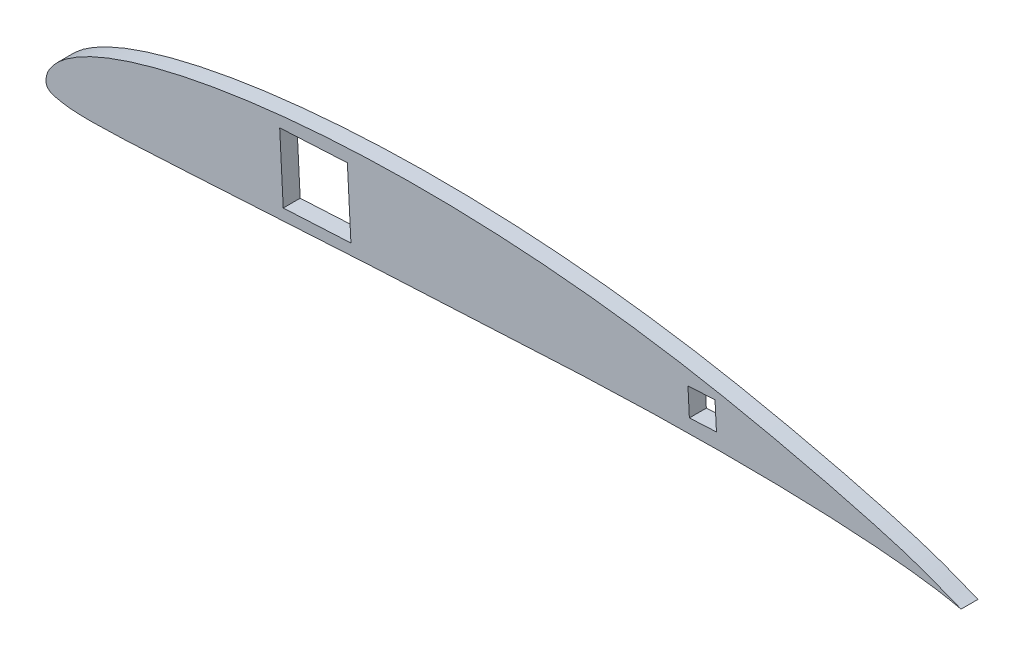
ISO-10303-21;
HEADER;
FILE_DESCRIPTION(('STEP AP214'),'2;1');
FILE_NAME('part.step','',(''),(''),'','','');
FILE_SCHEMA(('AUTOMOTIVE_DESIGN { 1 0 10303 214 1 1 1 1 }'));
ENDSEC;
DATA;
#1=APPLICATION_CONTEXT('core data for automotive mechanical design processes');
#2=APPLICATION_PROTOCOL_DEFINITION('international standard','automotive_design',2000,#1);
#3=PRODUCT_CONTEXT('',#1,'mechanical');
#4=PRODUCT('Part','Part','',(#3));
#5=PRODUCT_RELATED_PRODUCT_CATEGORY('part','',(#4));
#6=PRODUCT_DEFINITION_FORMATION('','',#4);
#7=PRODUCT_DEFINITION_CONTEXT('part definition',#1,'design');
#8=PRODUCT_DEFINITION('design','',#6,#7);
#9=PRODUCT_DEFINITION_SHAPE('','',#8);
#10=(LENGTH_UNIT() NAMED_UNIT(*) SI_UNIT(.MILLI.,.METRE.));
#11=(NAMED_UNIT(*) PLANE_ANGLE_UNIT() SI_UNIT($,.RADIAN.));
#12=(NAMED_UNIT(*) SI_UNIT($,.STERADIAN.) SOLID_ANGLE_UNIT());
#13=UNCERTAINTY_MEASURE_WITH_UNIT(LENGTH_MEASURE(1.E-05),#10,'distance_accuracy_value','');
#14=(GEOMETRIC_REPRESENTATION_CONTEXT(3) GLOBAL_UNCERTAINTY_ASSIGNED_CONTEXT((#13)) GLOBAL_UNIT_ASSIGNED_CONTEXT((#10,
#11,#12)) REPRESENTATION_CONTEXT('',''));
#15=CARTESIAN_POINT('',(0.,0.,0.));
#16=DIRECTION('',(0.,0.,1.));
#17=DIRECTION('',(1.,0.,0.));
#18=AXIS2_PLACEMENT_3D('',#15,#16,#17);
#19=CARTESIAN_POINT('',(1.48958372084306,4.18388069591457,5.));
#20=DIRECTION('',(0.,0.,-1.));
#21=DIRECTION('',(-1.,0.,0.));
#22=AXIS2_PLACEMENT_3D('',#19,#20,#21);
#23=PLANE('',#22);
#24=DIRECTION('',(-0.998629534754574,-0.0523359562429374,0.));
#25=VECTOR('',#24,1.);
#26=CARTESIAN_POINT('',(88.9258715702327,23.5193098199502,5.));
#27=LINE('',#26,#25);
#28=CARTESIAN_POINT('',(88.9258715702327,23.5193098199502,5.));
#29=VERTEX_POINT('',#28);
#30=CARTESIAN_POINT('',(68.9532808751413,22.4725906950915,5.));
#31=VERTEX_POINT('',#30);
#32=EDGE_CURVE('E138',#29,#31,#27,.T.);
#33=ORIENTED_EDGE('',*,*,#32,.F.);
#34=DIRECTION('',(-0.0523359562429375,0.998629534754574,0.));
#35=VECTOR('',#34,1.);
#36=CARTESIAN_POINT('',(89.9725906950915,3.54671912485872,5.));
#37=LINE('',#36,#35);
#38=CARTESIAN_POINT('',(89.9725906950915,3.54671912485872,5.));
#39=VERTEX_POINT('',#38);
#40=EDGE_CURVE('E146',#39,#29,#37,.T.);
#41=ORIENTED_EDGE('',*,*,#40,.F.);
#42=DIRECTION('',(0.998629534754574,0.0523359562429373,0.));
#43=VECTOR('',#42,1.);
#44=CARTESIAN_POINT('',(70.,2.49999999999998,5.));
#45=LINE('',#44,#43);
#46=CARTESIAN_POINT('',(70.,2.49999999999998,5.));
#47=VERTEX_POINT('',#46);
#48=EDGE_CURVE('E143',#47,#39,#45,.T.);
#49=ORIENTED_EDGE('',*,*,#48,.F.);
#50=DIRECTION('',(0.0523359562429368,-0.998629534754574,0.));
#51=VECTOR('',#50,1.);
#52=CARTESIAN_POINT('',(68.9532808751413,22.4725906950915,5.));
#53=LINE('',#52,#51);
#54=EDGE_CURVE('E140',#31,#47,#53,.T.);
#55=ORIENTED_EDGE('',*,*,#54,.F.);
#56=EDGE_LOOP('',(#33,#41,#49,#55));
#57=FACE_BOUND('',#56,.T.);
#58=CARTESIAN_POINT('',(270.,0.,5.));
#59=CARTESIAN_POINT('',(270.0014360667,0.00910740508498695,5.));
#60=CARTESIAN_POINT('',(268.932933557822,0.352495645864022,5.));
#61=CARTESIAN_POINT('',(267.906768705058,0.800062228703997,5.));
#62=CARTESIAN_POINT('',(265.493337403094,1.75473811170576,5.));
#63=CARTESIAN_POINT('',(262.648403106219,2.91950845694844,5.));
#64=CARTESIAN_POINT('',(259.022541080641,4.29942243260303,5.));
#65=CARTESIAN_POINT('',(254.761430831596,5.75422771444843,5.));
#66=CARTESIAN_POINT('',(249.810113571076,7.26527183587231,5.));
#67=CARTESIAN_POINT('',(244.21017544671,8.86000319046221,5.));
#68=CARTESIAN_POINT('',(237.993728290788,10.535115834764,5.));
#69=CARTESIAN_POINT('',(231.21222376915,12.2664909421061,5.));
#70=CARTESIAN_POINT('',(223.918686456541,14.035986434041,5.));
#71=CARTESIAN_POINT('',(216.168249336483,15.8176711323685,5.));
#72=CARTESIAN_POINT('',(208.019279368269,17.5868399892498,5.));
#73=CARTESIAN_POINT('',(199.531594050923,19.3088493186137,5.));
#74=CARTESIAN_POINT('',(190.757583874644,20.9526687823973,5.));
#75=CARTESIAN_POINT('',(181.729078705274,22.4465635348139,5.));
#76=CARTESIAN_POINT('',(172.485706502008,23.7788806265949,5.));
#77=CARTESIAN_POINT('',(163.067203004704,24.9496361071383,5.));
#78=CARTESIAN_POINT('',(153.514388276839,25.9260273545053,5.));
#79=CARTESIAN_POINT('',(143.873797478538,26.7206307506796,5.));
#80=CARTESIAN_POINT('',(134.190671535743,27.3179317617776,5.));
#81=CARTESIAN_POINT('',(124.515804535718,27.7064515241961,5.));
#82=CARTESIAN_POINT('',(114.898008488246,27.9026967115103,5.));
#83=CARTESIAN_POINT('',(105.384918155401,27.886864858242,5.));
#84=CARTESIAN_POINT('',(96.0258854219022,27.6680479529526,5.));
#85=CARTESIAN_POINT('',(86.8684038506323,27.2537526230879,5.));
#86=CARTESIAN_POINT('',(77.9613452334642,26.6449299280405,5.));
#87=CARTESIAN_POINT('',(69.3512981504534,25.8546018208466,5.));
#88=CARTESIAN_POINT('',(61.0839455025805,24.8871881500534,5.));
#89=CARTESIAN_POINT('',(53.2042833660714,23.7510726996345,5.));
#90=CARTESIAN_POINT('',(45.7522332397365,22.4644439817104,5.));
#91=CARTESIAN_POINT('',(38.7673170267867,21.0309444396935,5.));
#92=CARTESIAN_POINT('',(32.2854607788805,19.4682548669156,5.));
#93=CARTESIAN_POINT('',(26.3378446016865,17.7934950659202,5.));
#94=CARTESIAN_POINT('',(20.9568087425168,16.0157917509397,5.));
#95=CARTESIAN_POINT('',(16.1613307085821,14.167604477965,5.));
#96=CARTESIAN_POINT('',(11.9757307037267,12.2431034756435,5.));
#97=CARTESIAN_POINT('',(8.4190687169347,10.2590412623939,5.));
#98=CARTESIAN_POINT('',(5.47224296415656,8.27454832855855,5.));
#99=CARTESIAN_POINT('',(3.1624303225651,6.26126462358426,5.));
#100=CARTESIAN_POINT('',(1.47897938069594,4.29308317165897,5.));
#101=CARTESIAN_POINT('',(0.371136915206552,2.3887808601898,5.));
#102=CARTESIAN_POINT('',(-0.0281860539236262,0.61485563857857,5.));
#103=CARTESIAN_POINT('',(-0.0142206373523514,-1.03455531517698,5.));
#104=CARTESIAN_POINT('',(1.17017115098148,-2.32900820435546,5.));
#105=CARTESIAN_POINT('',(3.19159663794129,-2.8616102055205,5.));
#106=CARTESIAN_POINT('',(5.90093894084869,-3.41461398994113,5.));
#107=CARTESIAN_POINT('',(9.50377059385123,-3.67098844904862,5.));
#108=CARTESIAN_POINT('',(13.9401401755147,-3.73229189076624,5.));
#109=CARTESIAN_POINT('',(19.2374278625681,-3.61517977847622,5.));
#110=CARTESIAN_POINT('',(25.3684316113287,-3.36090066292526,5.));
#111=CARTESIAN_POINT('',(32.295387745952,-3.00445391740819,5.));
#112=CARTESIAN_POINT('',(39.9656881561273,-2.57018111205941,5.));
#113=CARTESIAN_POINT('',(48.322523013675,-2.07153516495246,5.));
#114=CARTESIAN_POINT('',(57.3050038651897,-1.53172129601224,5.));
#115=CARTESIAN_POINT('',(66.8467747260103,-0.961423360004259,5.));
#116=CARTESIAN_POINT('',(76.8780761891054,-0.378270294537066,5.));
#117=CARTESIAN_POINT('',(87.3250824317546,0.209915111489441,5.));
#118=CARTESIAN_POINT('',(98.1106897843523,0.793603647829826,5.));
#119=CARTESIAN_POINT('',(109.157898554784,1.36758916250899,5.));
#120=CARTESIAN_POINT('',(120.393777002651,1.94386938994531,5.));
#121=CARTESIAN_POINT('',(131.75791278309,2.54211638333123,5.));
#122=CARTESIAN_POINT('',(143.201063085681,3.13778281261522,5.));
#123=CARTESIAN_POINT('',(154.665861126763,3.70410173438214,5.));
#124=CARTESIAN_POINT('',(166.072995782862,4.17417573275371,5.));
#125=CARTESIAN_POINT('',(177.322016209765,4.51639399367127,5.));
#126=CARTESIAN_POINT('',(188.310538637782,4.74074780883225,5.));
#127=CARTESIAN_POINT('',(198.944977609885,4.83921239024152,5.));
#128=CARTESIAN_POINT('',(209.136302533756,4.80855101421534,5.));
#129=CARTESIAN_POINT('',(218.79629823797,4.64992155387397,5.));
#130=CARTESIAN_POINT('',(227.838646737916,4.36814179068766,5.));
#131=CARTESIAN_POINT('',(236.181287301788,3.9746736399858,5.));
#132=CARTESIAN_POINT('',(243.743065142294,3.48469108252562,5.));
#133=CARTESIAN_POINT('',(250.459331692246,2.91826721942611,5.));
#134=CARTESIAN_POINT('',(256.238976815333,2.31037158216879,5.));
#135=CARTESIAN_POINT('',(261.088929811527,1.66798004456643,5.));
#136=CARTESIAN_POINT('',(264.748869213918,1.08364117151456,5.));
#137=CARTESIAN_POINT('',(267.668480022305,0.489833575324206,5.));
#138=CARTESIAN_POINT('',(268.860809828443,0.278822671327756,5.));
#139=CARTESIAN_POINT('',(269.998549626617,-0.00919813677435478,5.));
#140=CARTESIAN_POINT('',(270.,0.,5.));
#141=B_SPLINE_CURVE_WITH_KNOTS('',3,(#58,#59,#60,#61,#62,#63,#64,#65,#66,#67,#68,#69,#70,#71,
#72,#73,#74,#75,#76,#77,#78,#79,#80,#81,#82,#83,#84,#85,#86,#87,#88,#89,#90,#91,#92,#93,#94,#95,
#96,#97,#98,#99,#100,#101,#102,#103,#104,#105,#106,#107,#108,#109,#110,#111,#112,#113,#114,#115,
#116,#117,#118,#119,#120,#121,#122,#123,#124,#125,#126,#127,#128,#129,#130,#131,#132,#133,#134,
#135,#136,#137,#138,#139,#140),.UNSPECIFIED.,.T.,.F.,(4,1,1,1,1,1,1,1,1,1,1,1,1,1,1,1,1,1,1,1,1,
1,1,1,1,1,1,1,1,1,1,1,1,1,1,1,1,1,1,1,1,1,1,1,1,1,1,1,1,1,1,1,1,1,1,1,1,1,1,1,1,1,1,1,1,1,1,1,1,
1,1,1,1,1,1,1,1,1,1,1,4),(0.,0.000978925200277459,0.00378591549023061,0.00817878586970771,
0.013939635702595,0.020914584154332,0.0290565975621921,0.0384135587113588,0.0489739715715676,
0.0606454194024025,0.0733338505321348,0.0869390748188673,0.101355022510081,0.116470864670874,
0.132170766848874,0.148332165360986,0.164889947509332,0.181806831021788,0.198986828660527,
0.216369092592437,0.233891214474879,0.25145520462322,0.268989943534912,0.286410198751259,
0.30363306022829,0.320588512817723,0.337187269596329,0.353353473374656,0.36901233500621,
0.384083454981517,0.398499749186594,0.412191496678254,0.425098469382076,0.437171363117538,
0.448351495068995,0.458605678988818,0.467900990608339,0.476215592972652,0.48357299062513,
0.489970137349999,0.495456443583994,0.500131702922336,0.503991848386412,0.507230007900311,
0.509986766870744,0.512500662152879,0.516073685181018,0.521095012002638,0.527571392405465,
0.535587320266656,0.545177110955053,0.556301642956373,0.568874715443027,0.582800205502827,
0.597975201944563,0.614286016356002,0.631612678153747,0.649825892256692,0.668791608390084,
0.688371085664615,0.708416852810966,0.728796853365483,0.749399048787055,0.770145767160638,
0.790953093304618,0.811664203475039,0.832074040882521,0.851999343771333,0.871281671964732,
0.889760566338039,0.907279933600535,0.923686413750604,0.938832510110946,0.952579326689716,
0.964796492179185,0.975364982161422,0.984179191960217,0.991107071249204,0.996049394239127,
0.999011322347037,1.),.UNSPECIFIED.);
#142=CARTESIAN_POINT('',(270.,0.,5.));
#143=VERTEX_POINT('',#142);
#144=EDGE_CURVE('E11',#143,#143,#141,.T.);
#145=ORIENTED_EDGE('',*,*,#144,.T.);
#146=EDGE_LOOP('',(#145));
#147=FACE_BOUND('',#146,.T.);
#148=DIRECTION('',(-0.998629534754574,-0.0523359562429382,0.));
#149=VECTOR('',#148,1.);
#150=CARTESIAN_POINT('',(197.405892798642,17.1880386771326,5.));
#151=LINE('',#150,#149);
#152=CARTESIAN_POINT('',(197.405892798642,17.1880386771326,5.));
#153=VERTEX_POINT('',#152);
#154=CARTESIAN_POINT('',(189.416856520605,16.7693510271891,5.));
#155=VERTEX_POINT('',#154);
#156=EDGE_CURVE('E102',#153,#155,#151,.T.);
#157=ORIENTED_EDGE('',*,*,#156,.F.);
#158=DIRECTION('',(-0.0523359562429396,0.998629534754574,0.));
#159=VECTOR('',#158,1.);
#160=CARTESIAN_POINT('',(197.824580448586,9.19900239909598,5.));
#161=LINE('',#160,#159);
#162=CARTESIAN_POINT('',(197.824580448586,9.19900239909598,5.));
#163=VERTEX_POINT('',#162);
#164=EDGE_CURVE('E124',#163,#153,#161,.T.);
#165=ORIENTED_EDGE('',*,*,#164,.F.);
#166=DIRECTION('',(0.998629534754574,0.0523359562429374,0.));
#167=VECTOR('',#166,1.);
#168=CARTESIAN_POINT('',(189.835544170549,8.78031474915248,5.));
#169=LINE('',#168,#167);
#170=CARTESIAN_POINT('',(189.835544170549,8.78031474915248,5.));
#171=VERTEX_POINT('',#170);
#172=EDGE_CURVE('E122',#171,#163,#169,.T.);
#173=ORIENTED_EDGE('',*,*,#172,.F.);
#174=DIRECTION('',(0.0523359562429362,-0.998629534754574,0.));
#175=VECTOR('',#174,1.);
#176=CARTESIAN_POINT('',(189.416856520605,16.7693510271891,5.));
#177=LINE('',#176,#175);
#178=EDGE_CURVE('E110',#155,#171,#177,.T.);
#179=ORIENTED_EDGE('',*,*,#178,.F.);
#180=EDGE_LOOP('',(#157,#165,#173,#179));
#181=FACE_BOUND('',#180,.T.);
#182=ADVANCED_FACE('F35',(#57,#147,#181),#23,.F.);
#183=CARTESIAN_POINT('',(1.48958372084306,4.18388069591457,0.));
#184=DIRECTION('',(0.,0.,-1.));
#185=DIRECTION('',(-1.,0.,0.));
#186=AXIS2_PLACEMENT_3D('',#183,#184,#185);
#187=PLANE('',#186);
#188=CARTESIAN_POINT('',(270.,0.,0.));
#189=CARTESIAN_POINT('',(270.0014360667,0.00910740508498695,0.));
#190=CARTESIAN_POINT('',(268.932933557822,0.352495645864022,0.));
#191=CARTESIAN_POINT('',(267.906768705058,0.800062228703997,0.));
#192=CARTESIAN_POINT('',(265.493337403094,1.75473811170576,0.));
#193=CARTESIAN_POINT('',(262.648403106219,2.91950845694844,0.));
#194=CARTESIAN_POINT('',(259.022541080641,4.29942243260303,0.));
#195=CARTESIAN_POINT('',(254.761430831596,5.75422771444843,0.));
#196=CARTESIAN_POINT('',(249.810113571076,7.26527183587231,0.));
#197=CARTESIAN_POINT('',(244.21017544671,8.86000319046221,0.));
#198=CARTESIAN_POINT('',(237.993728290788,10.535115834764,0.));
#199=CARTESIAN_POINT('',(231.21222376915,12.2664909421061,0.));
#200=CARTESIAN_POINT('',(223.918686456541,14.035986434041,0.));
#201=CARTESIAN_POINT('',(216.168249336483,15.8176711323685,0.));
#202=CARTESIAN_POINT('',(208.019279368269,17.5868399892498,0.));
#203=CARTESIAN_POINT('',(199.531594050923,19.3088493186137,0.));
#204=CARTESIAN_POINT('',(190.757583874644,20.9526687823973,0.));
#205=CARTESIAN_POINT('',(181.729078705274,22.4465635348139,0.));
#206=CARTESIAN_POINT('',(172.485706502008,23.7788806265949,0.));
#207=CARTESIAN_POINT('',(163.067203004704,24.9496361071383,0.));
#208=CARTESIAN_POINT('',(153.514388276839,25.9260273545053,0.));
#209=CARTESIAN_POINT('',(143.873797478538,26.7206307506796,0.));
#210=CARTESIAN_POINT('',(134.190671535743,27.3179317617776,0.));
#211=CARTESIAN_POINT('',(124.515804535718,27.7064515241961,0.));
#212=CARTESIAN_POINT('',(114.898008488246,27.9026967115103,0.));
#213=CARTESIAN_POINT('',(105.384918155401,27.886864858242,0.));
#214=CARTESIAN_POINT('',(96.0258854219022,27.6680479529526,0.));
#215=CARTESIAN_POINT('',(86.8684038506323,27.2537526230879,0.));
#216=CARTESIAN_POINT('',(77.9613452334642,26.6449299280405,0.));
#217=CARTESIAN_POINT('',(69.3512981504534,25.8546018208466,0.));
#218=CARTESIAN_POINT('',(61.0839455025805,24.8871881500534,0.));
#219=CARTESIAN_POINT('',(53.2042833660714,23.7510726996345,0.));
#220=CARTESIAN_POINT('',(45.7522332397365,22.4644439817104,0.));
#221=CARTESIAN_POINT('',(38.7673170267867,21.0309444396935,0.));
#222=CARTESIAN_POINT('',(32.2854607788805,19.4682548669156,0.));
#223=CARTESIAN_POINT('',(26.3378446016865,17.7934950659202,0.));
#224=CARTESIAN_POINT('',(20.9568087425168,16.0157917509397,0.));
#225=CARTESIAN_POINT('',(16.1613307085821,14.167604477965,0.));
#226=CARTESIAN_POINT('',(11.9757307037267,12.2431034756435,0.));
#227=CARTESIAN_POINT('',(8.4190687169347,10.2590412623939,0.));
#228=CARTESIAN_POINT('',(5.47224296415656,8.27454832855855,0.));
#229=CARTESIAN_POINT('',(3.1624303225651,6.26126462358426,0.));
#230=CARTESIAN_POINT('',(1.47897938069594,4.29308317165897,0.));
#231=CARTESIAN_POINT('',(0.371136915206552,2.3887808601898,0.));
#232=CARTESIAN_POINT('',(-0.0281860539236262,0.61485563857857,0.));
#233=CARTESIAN_POINT('',(-0.0142206373523514,-1.03455531517698,0.));
#234=CARTESIAN_POINT('',(1.17017115098148,-2.32900820435546,0.));
#235=CARTESIAN_POINT('',(3.19159663794129,-2.8616102055205,0.));
#236=CARTESIAN_POINT('',(5.90093894084869,-3.41461398994113,0.));
#237=CARTESIAN_POINT('',(9.50377059385123,-3.67098844904862,0.));
#238=CARTESIAN_POINT('',(13.9401401755147,-3.73229189076624,0.));
#239=CARTESIAN_POINT('',(19.2374278625681,-3.61517977847622,0.));
#240=CARTESIAN_POINT('',(25.3684316113287,-3.36090066292526,0.));
#241=CARTESIAN_POINT('',(32.295387745952,-3.00445391740819,0.));
#242=CARTESIAN_POINT('',(39.9656881561273,-2.57018111205941,0.));
#243=CARTESIAN_POINT('',(48.322523013675,-2.07153516495246,0.));
#244=CARTESIAN_POINT('',(57.3050038651897,-1.53172129601224,0.));
#245=CARTESIAN_POINT('',(66.8467747260103,-0.961423360004259,0.));
#246=CARTESIAN_POINT('',(76.8780761891054,-0.378270294537066,0.));
#247=CARTESIAN_POINT('',(87.3250824317546,0.209915111489441,0.));
#248=CARTESIAN_POINT('',(98.1106897843523,0.793603647829826,0.));
#249=CARTESIAN_POINT('',(109.157898554784,1.36758916250899,0.));
#250=CARTESIAN_POINT('',(120.393777002651,1.94386938994531,0.));
#251=CARTESIAN_POINT('',(131.75791278309,2.54211638333123,0.));
#252=CARTESIAN_POINT('',(143.201063085681,3.13778281261522,0.));
#253=CARTESIAN_POINT('',(154.665861126763,3.70410173438214,0.));
#254=CARTESIAN_POINT('',(166.072995782862,4.17417573275371,0.));
#255=CARTESIAN_POINT('',(177.322016209765,4.51639399367127,0.));
#256=CARTESIAN_POINT('',(188.310538637782,4.74074780883225,0.));
#257=CARTESIAN_POINT('',(198.944977609885,4.83921239024152,0.));
#258=CARTESIAN_POINT('',(209.136302533756,4.80855101421534,0.));
#259=CARTESIAN_POINT('',(218.79629823797,4.64992155387397,0.));
#260=CARTESIAN_POINT('',(227.838646737916,4.36814179068766,0.));
#261=CARTESIAN_POINT('',(236.181287301788,3.9746736399858,0.));
#262=CARTESIAN_POINT('',(243.743065142294,3.48469108252562,0.));
#263=CARTESIAN_POINT('',(250.459331692246,2.91826721942611,0.));
#264=CARTESIAN_POINT('',(256.238976815333,2.31037158216879,0.));
#265=CARTESIAN_POINT('',(261.088929811527,1.66798004456643,0.));
#266=CARTESIAN_POINT('',(264.748869213918,1.08364117151456,0.));
#267=CARTESIAN_POINT('',(267.668480022305,0.489833575324206,0.));
#268=CARTESIAN_POINT('',(268.860809828443,0.278822671327756,0.));
#269=CARTESIAN_POINT('',(269.998549626617,-0.00919813677435478,0.));
#270=CARTESIAN_POINT('',(270.,0.,0.));
#271=B_SPLINE_CURVE_WITH_KNOTS('',3,(#188,#189,#190,#191,#192,#193,#194,#195,#196,#197,#198,
#199,#200,#201,#202,#203,#204,#205,#206,#207,#208,#209,#210,#211,#212,#213,#214,#215,#216,#217,
#218,#219,#220,#221,#222,#223,#224,#225,#226,#227,#228,#229,#230,#231,#232,#233,#234,#235,#236,
#237,#238,#239,#240,#241,#242,#243,#244,#245,#246,#247,#248,#249,#250,#251,#252,#253,#254,#255,
#256,#257,#258,#259,#260,#261,#262,#263,#264,#265,#266,#267,#268,#269,#270),.UNSPECIFIED.,.T.,
.F.,(4,1,1,1,1,1,1,1,1,1,1,1,1,1,1,1,1,1,1,1,1,1,1,1,1,1,1,1,1,1,1,1,1,1,1,1,1,1,1,1,1,1,1,1,1,
1,1,1,1,1,1,1,1,1,1,1,1,1,1,1,1,1,1,1,1,1,1,1,1,1,1,1,1,1,1,1,1,1,1,1,4),(0.,
0.000978925200277459,0.00378591549023061,0.00817878586970771,0.013939635702595,
0.020914584154332,0.0290565975621921,0.0384135587113588,0.0489739715715676,0.0606454194024025,
0.0733338505321348,0.0869390748188673,0.101355022510081,0.116470864670874,0.132170766848874,
0.148332165360986,0.164889947509332,0.181806831021788,0.198986828660527,0.216369092592437,
0.233891214474879,0.25145520462322,0.268989943534912,0.286410198751259,0.30363306022829,
0.320588512817723,0.337187269596329,0.353353473374656,0.36901233500621,0.384083454981517,
0.398499749186594,0.412191496678254,0.425098469382076,0.437171363117538,0.448351495068995,
0.458605678988818,0.467900990608339,0.476215592972652,0.48357299062513,0.489970137349999,
0.495456443583994,0.500131702922336,0.503991848386412,0.507230007900311,0.509986766870744,
0.512500662152879,0.516073685181018,0.521095012002638,0.527571392405465,0.535587320266656,
0.545177110955053,0.556301642956373,0.568874715443027,0.582800205502827,0.597975201944563,
0.614286016356002,0.631612678153747,0.649825892256692,0.668791608390084,0.688371085664615,
0.708416852810966,0.728796853365483,0.749399048787055,0.770145767160638,0.790953093304618,
0.811664203475039,0.832074040882521,0.851999343771333,0.871281671964732,0.889760566338039,
0.907279933600535,0.923686413750604,0.938832510110946,0.952579326689716,0.964796492179185,
0.975364982161422,0.984179191960217,0.991107071249204,0.996049394239127,0.999011322347037,1.),.UNSPECIFIED.);
#272=CARTESIAN_POINT('',(270.,0.,0.));
#273=VERTEX_POINT('',#272);
#274=EDGE_CURVE('E40',#273,#273,#271,.T.);
#275=ORIENTED_EDGE('',*,*,#274,.F.);
#276=EDGE_LOOP('',(#275));
#277=FACE_BOUND('',#276,.T.);
#278=DIRECTION('',(-0.0523359562429375,0.998629534754574,0.));
#279=VECTOR('',#278,1.);
#280=CARTESIAN_POINT('',(89.9725906950915,3.54671912485872,0.));
#281=LINE('',#280,#279);
#282=CARTESIAN_POINT('',(89.9725906950915,3.54671912485872,0.));
#283=VERTEX_POINT('',#282);
#284=CARTESIAN_POINT('',(88.9258715702328,23.5193098199502,0.));
#285=VERTEX_POINT('',#284);
#286=EDGE_CURVE('E141',#283,#285,#281,.T.);
#287=ORIENTED_EDGE('',*,*,#286,.T.);
#288=DIRECTION('',(-0.998629534754574,-0.0523359562429374,0.));
#289=VECTOR('',#288,1.);
#290=CARTESIAN_POINT('',(88.9258715702327,23.5193098199502,0.));
#291=LINE('',#290,#289);
#292=CARTESIAN_POINT('',(68.9532808751413,22.4725906950915,0.));
#293=VERTEX_POINT('',#292);
#294=EDGE_CURVE('E118',#285,#293,#291,.T.);
#295=ORIENTED_EDGE('',*,*,#294,.T.);
#296=DIRECTION('',(0.0523359562429368,-0.998629534754574,0.));
#297=VECTOR('',#296,1.);
#298=CARTESIAN_POINT('',(68.9532808751413,22.4725906950915,0.));
#299=LINE('',#298,#297);
#300=CARTESIAN_POINT('',(70.,2.49999999999998,0.));
#301=VERTEX_POINT('',#300);
#302=EDGE_CURVE('E151',#293,#301,#299,.T.);
#303=ORIENTED_EDGE('',*,*,#302,.T.);
#304=DIRECTION('',(0.998629534754574,0.0523359562429373,0.));
#305=VECTOR('',#304,1.);
#306=CARTESIAN_POINT('',(70.,2.49999999999998,0.));
#307=LINE('',#306,#305);
#308=EDGE_CURVE('E154',#301,#283,#307,.T.);
#309=ORIENTED_EDGE('',*,*,#308,.T.);
#310=EDGE_LOOP('',(#287,#295,#303,#309));
#311=FACE_BOUND('',#310,.T.);
#312=DIRECTION('',(-0.0523359562429396,0.998629534754574,0.));
#313=VECTOR('',#312,1.);
#314=CARTESIAN_POINT('',(197.824580448586,9.19900239909598,0.));
#315=LINE('',#314,#313);
#316=CARTESIAN_POINT('',(197.824580448586,9.19900239909598,0.));
#317=VERTEX_POINT('',#316);
#318=CARTESIAN_POINT('',(197.405892798642,17.1880386771326,0.));
#319=VERTEX_POINT('',#318);
#320=EDGE_CURVE('E111',#317,#319,#315,.T.);
#321=ORIENTED_EDGE('',*,*,#320,.T.);
#322=DIRECTION('',(-0.998629534754574,-0.0523359562429382,0.));
#323=VECTOR('',#322,1.);
#324=CARTESIAN_POINT('',(197.405892798642,17.1880386771326,0.));
#325=LINE('',#324,#323);
#326=CARTESIAN_POINT('',(189.416856520605,16.7693510271891,0.));
#327=VERTEX_POINT('',#326);
#328=EDGE_CURVE('E60',#319,#327,#325,.T.);
#329=ORIENTED_EDGE('',*,*,#328,.T.);
#330=DIRECTION('',(0.0523359562429362,-0.998629534754574,0.));
#331=VECTOR('',#330,1.);
#332=CARTESIAN_POINT('',(189.416856520605,16.7693510271891,0.));
#333=LINE('',#332,#331);
#334=CARTESIAN_POINT('',(189.835544170549,8.78031474915248,0.));
#335=VERTEX_POINT('',#334);
#336=EDGE_CURVE('E117',#327,#335,#333,.T.);
#337=ORIENTED_EDGE('',*,*,#336,.T.);
#338=DIRECTION('',(0.998629534754574,0.0523359562429374,0.));
#339=VECTOR('',#338,1.);
#340=CARTESIAN_POINT('',(189.835544170549,8.78031474915248,0.));
#341=LINE('',#340,#339);
#342=EDGE_CURVE('E130',#335,#317,#341,.T.);
#343=ORIENTED_EDGE('',*,*,#342,.T.);
#344=EDGE_LOOP('',(#321,#329,#337,#343));
#345=FACE_BOUND('',#344,.T.);
#346=ADVANCED_FACE('F179',(#277,#311,#345),#187,.T.);
#347=DIRECTION('',(0.,0.,-1.));
#348=VECTOR('',#347,1.);
#349=SURFACE_OF_LINEAR_EXTRUSION('',#141,#348);
#350=ORIENTED_EDGE('',*,*,#144,.F.);
#351=EDGE_LOOP('',(#350));
#352=FACE_BOUND('',#351,.T.);
#353=ORIENTED_EDGE('',*,*,#274,.T.);
#354=EDGE_LOOP('',(#353));
#355=FACE_BOUND('',#354,.T.);
#356=ADVANCED_FACE('F37',(#352,#355),#349,.F.);
#357=CARTESIAN_POINT('',(88.9258715702327,23.5193098199502,5.));
#358=DIRECTION('',(0.0523359562429374,-0.998629534754574,0.));
#359=DIRECTION('',(0.998629534754574,0.0523359562429374,0.));
#360=AXIS2_PLACEMENT_3D('',#357,#358,#359);
#361=PLANE('',#360);
#362=ORIENTED_EDGE('',*,*,#294,.F.);
#363=DIRECTION('',(0.,0.,-1.));
#364=VECTOR('',#363,1.);
#365=CARTESIAN_POINT('',(88.9258715702327,23.5193098199502,5.));
#366=LINE('',#365,#364);
#367=EDGE_CURVE('E148',#29,#285,#366,.T.);
#368=ORIENTED_EDGE('',*,*,#367,.F.);
#369=ORIENTED_EDGE('',*,*,#32,.T.);
#370=DIRECTION('',(0.,0.,-1.));
#371=VECTOR('',#370,1.);
#372=CARTESIAN_POINT('',(68.9532808751413,22.4725906950915,5.));
#373=LINE('',#372,#371);
#374=EDGE_CURVE('E165',#31,#293,#373,.T.);
#375=ORIENTED_EDGE('',*,*,#374,.T.);
#376=EDGE_LOOP('',(#362,#368,#369,#375));
#377=FACE_BOUND('',#376,.T.);
#378=ADVANCED_FACE('F202',(#377),#361,.T.);
#379=CARTESIAN_POINT('',(68.9532808751413,22.4725906950915,5.));
#380=DIRECTION('',(0.998629534754574,0.0523359562429368,0.));
#381=DIRECTION('',(-0.0523359562429368,0.998629534754574,0.));
#382=AXIS2_PLACEMENT_3D('',#379,#380,#381);
#383=PLANE('',#382);
#384=ORIENTED_EDGE('',*,*,#302,.F.);
#385=ORIENTED_EDGE('',*,*,#374,.F.);
#386=ORIENTED_EDGE('',*,*,#54,.T.);
#387=DIRECTION('',(0.,0.,-1.));
#388=VECTOR('',#387,1.);
#389=CARTESIAN_POINT('',(70.,2.49999999999998,5.));
#390=LINE('',#389,#388);
#391=EDGE_CURVE('E163',#47,#301,#390,.T.);
#392=ORIENTED_EDGE('',*,*,#391,.T.);
#393=EDGE_LOOP('',(#384,#385,#386,#392));
#394=FACE_BOUND('',#393,.T.);
#395=ADVANCED_FACE('F205',(#394),#383,.T.);
#396=CARTESIAN_POINT('',(70.,2.49999999999998,5.));
#397=DIRECTION('',(-0.0523359562429373,0.998629534754574,0.));
#398=DIRECTION('',(-0.998629534754574,-0.0523359562429373,0.));
#399=AXIS2_PLACEMENT_3D('',#396,#397,#398);
#400=PLANE('',#399);
#401=ORIENTED_EDGE('',*,*,#308,.F.);
#402=ORIENTED_EDGE('',*,*,#391,.F.);
#403=ORIENTED_EDGE('',*,*,#48,.T.);
#404=DIRECTION('',(0.,0.,-1.));
#405=VECTOR('',#404,1.);
#406=CARTESIAN_POINT('',(89.9725906950915,3.54671912485872,5.));
#407=LINE('',#406,#405);
#408=EDGE_CURVE('E161',#39,#283,#407,.T.);
#409=ORIENTED_EDGE('',*,*,#408,.T.);
#410=EDGE_LOOP('',(#401,#402,#403,#409));
#411=FACE_BOUND('',#410,.T.);
#412=ADVANCED_FACE('F208',(#411),#400,.T.);
#413=CARTESIAN_POINT('',(89.9725906950915,3.54671912485872,5.));
#414=DIRECTION('',(-0.998629534754574,-0.0523359562429375,0.));
#415=DIRECTION('',(0.0523359562429375,-0.998629534754574,0.));
#416=AXIS2_PLACEMENT_3D('',#413,#414,#415);
#417=PLANE('',#416);
#418=ORIENTED_EDGE('',*,*,#286,.F.);
#419=ORIENTED_EDGE('',*,*,#408,.F.);
#420=ORIENTED_EDGE('',*,*,#40,.T.);
#421=ORIENTED_EDGE('',*,*,#367,.T.);
#422=EDGE_LOOP('',(#418,#419,#420,#421));
#423=FACE_BOUND('',#422,.T.);
#424=ADVANCED_FACE('F212',(#423),#417,.T.);
#425=CARTESIAN_POINT('',(197.405892798642,17.1880386771326,5.));
#426=DIRECTION('',(0.0523359562429382,-0.998629534754574,0.));
#427=DIRECTION('',(0.998629534754574,0.0523359562429382,0.));
#428=AXIS2_PLACEMENT_3D('',#425,#426,#427);
#429=PLANE('',#428);
#430=ORIENTED_EDGE('',*,*,#328,.F.);
#431=DIRECTION('',(0.,0.,-1.));
#432=VECTOR('',#431,1.);
#433=CARTESIAN_POINT('',(197.405892798642,17.1880386771326,5.));
#434=LINE('',#433,#432);
#435=EDGE_CURVE('E106',#153,#319,#434,.T.);
#436=ORIENTED_EDGE('',*,*,#435,.F.);
#437=ORIENTED_EDGE('',*,*,#156,.T.);
#438=DIRECTION('',(0.,0.,-1.));
#439=VECTOR('',#438,1.);
#440=CARTESIAN_POINT('',(189.416856520605,16.7693510271891,5.));
#441=LINE('',#440,#439);
#442=EDGE_CURVE('E105',#155,#327,#441,.T.);
#443=ORIENTED_EDGE('',*,*,#442,.T.);
#444=EDGE_LOOP('',(#430,#436,#437,#443));
#445=FACE_BOUND('',#444,.T.);
#446=ADVANCED_FACE('F104',(#445),#429,.T.);
#447=CARTESIAN_POINT('',(189.416856520605,16.7693510271891,5.));
#448=DIRECTION('',(0.998629534754574,0.0523359562429362,0.));
#449=DIRECTION('',(-0.0523359562429362,0.998629534754574,0.));
#450=AXIS2_PLACEMENT_3D('',#447,#448,#449);
#451=PLANE('',#450);
#452=ORIENTED_EDGE('',*,*,#336,.F.);
#453=ORIENTED_EDGE('',*,*,#442,.F.);
#454=ORIENTED_EDGE('',*,*,#178,.T.);
#455=DIRECTION('',(0.,0.,-1.));
#456=VECTOR('',#455,1.);
#457=CARTESIAN_POINT('',(189.835544170549,8.78031474915248,5.));
#458=LINE('',#457,#456);
#459=EDGE_CURVE('E119',#171,#335,#458,.T.);
#460=ORIENTED_EDGE('',*,*,#459,.T.);
#461=EDGE_LOOP('',(#452,#453,#454,#460));
#462=FACE_BOUND('',#461,.T.);
#463=ADVANCED_FACE('F114',(#462),#451,.T.);
#464=CARTESIAN_POINT('',(189.835544170549,8.78031474915248,5.));
#465=DIRECTION('',(-0.0523359562429374,0.998629534754574,0.));
#466=DIRECTION('',(-0.998629534754574,-0.0523359562429374,0.));
#467=AXIS2_PLACEMENT_3D('',#464,#465,#466);
#468=PLANE('',#467);
#469=ORIENTED_EDGE('',*,*,#342,.F.);
#470=ORIENTED_EDGE('',*,*,#459,.F.);
#471=ORIENTED_EDGE('',*,*,#172,.T.);
#472=DIRECTION('',(0.,0.,-1.));
#473=VECTOR('',#472,1.);
#474=CARTESIAN_POINT('',(197.824580448586,9.19900239909598,5.));
#475=LINE('',#474,#473);
#476=EDGE_CURVE('E52',#163,#317,#475,.T.);
#477=ORIENTED_EDGE('',*,*,#476,.T.);
#478=EDGE_LOOP('',(#469,#470,#471,#477));
#479=FACE_BOUND('',#478,.T.);
#480=ADVANCED_FACE('F187',(#479),#468,.T.);
#481=CARTESIAN_POINT('',(197.824580448586,9.19900239909598,5.));
#482=DIRECTION('',(-0.998629534754574,-0.0523359562429396,0.));
#483=DIRECTION('',(0.0523359562429396,-0.998629534754574,0.));
#484=AXIS2_PLACEMENT_3D('',#481,#482,#483);
#485=PLANE('',#484);
#486=ORIENTED_EDGE('',*,*,#320,.F.);
#487=ORIENTED_EDGE('',*,*,#476,.F.);
#488=ORIENTED_EDGE('',*,*,#164,.T.);
#489=ORIENTED_EDGE('',*,*,#435,.T.);
#490=EDGE_LOOP('',(#486,#487,#488,#489));
#491=FACE_BOUND('',#490,.T.);
#492=ADVANCED_FACE('F185',(#491),#485,.T.);
#493=CLOSED_SHELL('',(#182,#346,#356,#378,#395,#412,#424,#446,#463,#480,#492));
#494=MANIFOLD_SOLID_BREP('B2',#493);
#495=ADVANCED_BREP_SHAPE_REPRESENTATION('',(#18,#494),#14);
#496=SHAPE_DEFINITION_REPRESENTATION(#9,#495);
ENDSEC;
END-ISO-10303-21;
